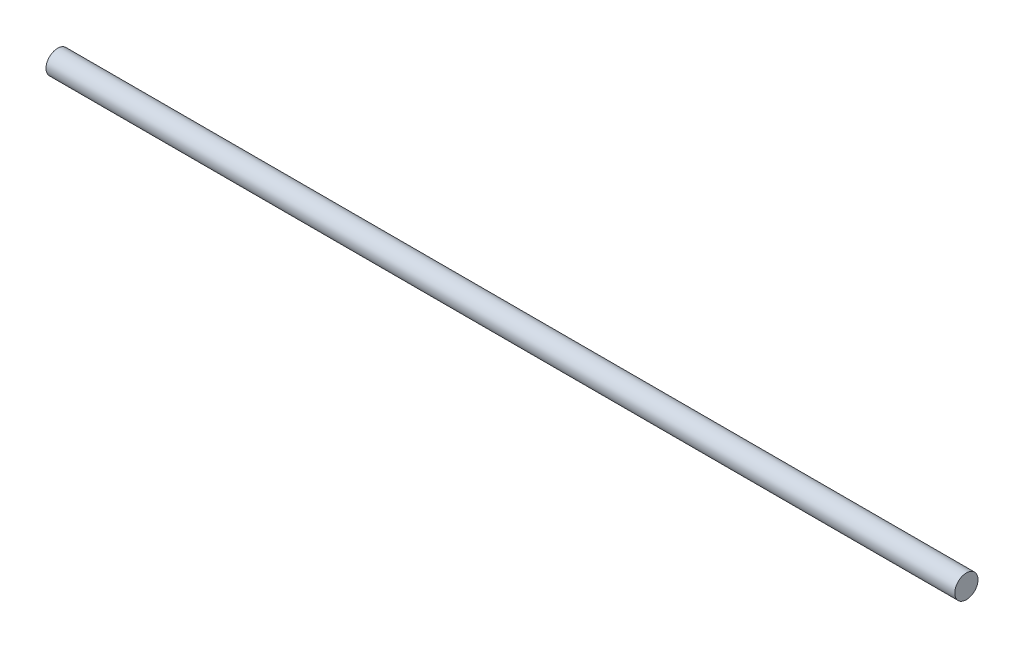
ISO-10303-21;
HEADER;
FILE_DESCRIPTION(('STEP AP214'),'2;1');
FILE_NAME('part.step','',(''),(''),'','','');
FILE_SCHEMA(('AUTOMOTIVE_DESIGN { 1 0 10303 214 1 1 1 1 }'));
ENDSEC;
DATA;
#1=APPLICATION_CONTEXT('core data for automotive mechanical design processes');
#2=APPLICATION_PROTOCOL_DEFINITION('international standard','automotive_design',2000,#1);
#3=PRODUCT_CONTEXT('',#1,'mechanical');
#4=PRODUCT('Part','Part','',(#3));
#5=PRODUCT_RELATED_PRODUCT_CATEGORY('part','',(#4));
#6=PRODUCT_DEFINITION_FORMATION('','',#4);
#7=PRODUCT_DEFINITION_CONTEXT('part definition',#1,'design');
#8=PRODUCT_DEFINITION('design','',#6,#7);
#9=PRODUCT_DEFINITION_SHAPE('','',#8);
#10=(LENGTH_UNIT() NAMED_UNIT(*) SI_UNIT(.MILLI.,.METRE.));
#11=(NAMED_UNIT(*) PLANE_ANGLE_UNIT() SI_UNIT($,.RADIAN.));
#12=(NAMED_UNIT(*) SI_UNIT($,.STERADIAN.) SOLID_ANGLE_UNIT());
#13=UNCERTAINTY_MEASURE_WITH_UNIT(LENGTH_MEASURE(1.E-05),#10,'distance_accuracy_value','');
#14=(GEOMETRIC_REPRESENTATION_CONTEXT(3) GLOBAL_UNCERTAINTY_ASSIGNED_CONTEXT((#13)) GLOBAL_UNIT_ASSIGNED_CONTEXT((#10,
#11,#12)) REPRESENTATION_CONTEXT('',''));
#15=CARTESIAN_POINT('',(0.,0.,0.));
#16=DIRECTION('',(0.,0.,1.));
#17=DIRECTION('',(1.,0.,0.));
#18=AXIS2_PLACEMENT_3D('',#15,#16,#17);
#19=CARTESIAN_POINT('',(79.375,0.,0.));
#20=DIRECTION('',(-1.,0.,0.));
#21=DIRECTION('',(0.,0.,1.));
#22=AXIS2_PLACEMENT_3D('',#19,#20,#21);
#23=CYLINDRICAL_SURFACE('',#22,1.016);
#24=CARTESIAN_POINT('',(79.375,0.,0.));
#25=DIRECTION('',(1.,0.,0.));
#26=DIRECTION('',(0.,0.,-1.));
#27=AXIS2_PLACEMENT_3D('',#24,#25,#26);
#28=CIRCLE('',#27,1.016);
#29=CARTESIAN_POINT('',(79.375,0.,1.016));
#30=VERTEX_POINT('',#29);
#31=EDGE_CURVE('E10',#30,#30,#28,.T.);
#32=CARTESIAN_POINT('',(0.,0.,0.));
#33=DIRECTION('',(1.,0.,0.));
#34=DIRECTION('',(0.,0.,-1.));
#35=AXIS2_PLACEMENT_3D('',#32,#33,#34);
#36=CIRCLE('',#35,1.016);
#37=CARTESIAN_POINT('',(0.,0.,1.016));
#38=VERTEX_POINT('',#37);
#39=EDGE_CURVE('E32',#38,#38,#36,.T.);
#40=CARTESIAN_POINT('',(79.375,0.,1.016));
#41=CARTESIAN_POINT('',(78.5481770833333,0.,1.016));
#42=CARTESIAN_POINT('',(77.7213541666667,0.,1.016));
#43=CARTESIAN_POINT('',(76.0677083333333,0.,1.016));
#44=CARTESIAN_POINT('',(75.2408854166667,0.,1.016));
#45=CARTESIAN_POINT('',(73.5872395833333,0.,1.016));
#46=CARTESIAN_POINT('',(72.7604166666667,0.,1.016));
#47=CARTESIAN_POINT('',(71.1067708333333,0.,1.016));
#48=CARTESIAN_POINT('',(70.2799479166667,0.,1.016));
#49=CARTESIAN_POINT('',(68.6263020833333,0.,1.016));
#50=CARTESIAN_POINT('',(67.7994791666666,0.,1.016));
#51=CARTESIAN_POINT('',(66.1458333333333,0.,1.016));
#52=CARTESIAN_POINT('',(65.3190104166667,0.,1.016));
#53=CARTESIAN_POINT('',(63.6653645833333,0.,1.016));
#54=CARTESIAN_POINT('',(62.8385416666667,0.,1.016));
#55=CARTESIAN_POINT('',(61.1848958333333,0.,1.016));
#56=CARTESIAN_POINT('',(60.3580729166667,0.,1.016));
#57=CARTESIAN_POINT('',(58.7044270833333,0.,1.016));
#58=CARTESIAN_POINT('',(57.8776041666667,0.,1.016));
#59=CARTESIAN_POINT('',(56.2239583333333,0.,1.016));
#60=CARTESIAN_POINT('',(55.3971354166667,0.,1.016));
#61=CARTESIAN_POINT('',(53.7434895833333,0.,1.016));
#62=CARTESIAN_POINT('',(52.9166666666667,0.,1.016));
#63=CARTESIAN_POINT('',(51.2630208333333,0.,1.016));
#64=CARTESIAN_POINT('',(50.4361979166667,0.,1.016));
#65=CARTESIAN_POINT('',(48.7825520833333,0.,1.016));
#66=CARTESIAN_POINT('',(47.9557291666667,0.,1.016));
#67=CARTESIAN_POINT('',(46.3020833333333,0.,1.016));
#68=CARTESIAN_POINT('',(45.4752604166667,0.,1.016));
#69=CARTESIAN_POINT('',(43.8216145833333,0.,1.016));
#70=CARTESIAN_POINT('',(42.9947916666667,0.,1.016));
#71=CARTESIAN_POINT('',(41.3411458333333,0.,1.016));
#72=CARTESIAN_POINT('',(40.5143229166667,0.,1.016));
#73=CARTESIAN_POINT('',(38.8606770833333,0.,1.016));
#74=CARTESIAN_POINT('',(38.0338541666667,0.,1.016));
#75=CARTESIAN_POINT('',(36.3802083333333,0.,1.016));
#76=CARTESIAN_POINT('',(35.5533854166667,0.,1.016));
#77=CARTESIAN_POINT('',(33.8997395833333,0.,1.016));
#78=CARTESIAN_POINT('',(33.0729166666667,0.,1.016));
#79=CARTESIAN_POINT('',(31.4192708333333,0.,1.016));
#80=CARTESIAN_POINT('',(30.5924479166667,0.,1.016));
#81=CARTESIAN_POINT('',(28.9388020833333,0.,1.016));
#82=CARTESIAN_POINT('',(28.1119791666667,0.,1.016));
#83=CARTESIAN_POINT('',(26.4583333333333,0.,1.016));
#84=CARTESIAN_POINT('',(25.6315104166666,0.,1.016));
#85=CARTESIAN_POINT('',(23.9778645833333,0.,1.016));
#86=CARTESIAN_POINT('',(23.1510416666666,0.,1.016));
#87=CARTESIAN_POINT('',(21.4973958333333,0.,1.016));
#88=CARTESIAN_POINT('',(20.6705729166666,0.,1.016));
#89=CARTESIAN_POINT('',(19.0169270833333,0.,1.016));
#90=CARTESIAN_POINT('',(18.1901041666666,0.,1.016));
#91=CARTESIAN_POINT('',(16.5364583333333,0.,1.016));
#92=CARTESIAN_POINT('',(15.7096354166667,0.,1.016));
#93=CARTESIAN_POINT('',(14.0559895833333,0.,1.016));
#94=CARTESIAN_POINT('',(13.2291666666667,0.,1.016));
#95=CARTESIAN_POINT('',(11.5755208333333,0.,1.016));
#96=CARTESIAN_POINT('',(10.7486979166667,0.,1.016));
#97=CARTESIAN_POINT('',(9.09505208333332,0.,1.016));
#98=CARTESIAN_POINT('',(8.26822916666666,0.,1.016));
#99=CARTESIAN_POINT('',(6.61458333333332,0.,1.016));
#100=CARTESIAN_POINT('',(5.78776041666665,0.,1.016));
#101=CARTESIAN_POINT('',(4.13411458333332,0.,1.016));
#102=CARTESIAN_POINT('',(3.30729166666666,0.,1.016));
#103=CARTESIAN_POINT('',(1.65364583333332,0.,1.016));
#104=CARTESIAN_POINT('',(0.826822916666655,0.,1.016));
#105=CARTESIAN_POINT('',(0.,0.,1.016));
#106=B_SPLINE_CURVE_WITH_KNOTS('',3,(#40,#41,#42,#43,#44,#45,#46,#47,#48,#49,#50,#51,#52,#53,
#54,#55,#56,#57,#58,#59,#60,#61,#62,#63,#64,#65,#66,#67,#68,#69,#70,#71,#72,#73,#74,#75,#76,#77,
#78,#79,#80,#81,#82,#83,#84,#85,#86,#87,#88,#89,#90,#91,#92,#93,#94,#95,#96,#97,#98,#99,#100,
#101,#102,#103,#104,#105),.UNSPECIFIED.,.F.,.F.,(4,2,2,2,2,2,2,2,2,2,2,2,2,2,2,2,2,2,2,2,2,2,2,
2,2,2,2,2,2,2,2,2,4),(0.,2.48046875000001,4.96093750000001,7.44140625,9.92187500000001,
12.40234375,14.8828125,17.36328125,19.84375,22.32421875,24.8046875,27.28515625,29.765625,
32.24609375,34.7265625,37.20703125,39.6875,42.16796875,44.6484375,47.12890625,49.609375,
52.08984375,54.5703125,57.05078125,59.53125,62.01171875,64.4921875,66.97265625,69.453125,
71.93359375,74.4140625,76.89453125,79.375),.UNSPECIFIED.);
#107=EDGE_CURVE('BSEAM29',#30,#38,#106,.T.);
#108=ORIENTED_EDGE('',*,*,#31,.F.);
#109=ORIENTED_EDGE('',*,*,#39,.T.);
#110=ORIENTED_EDGE('',*,*,#107,.T.);
#111=ORIENTED_EDGE('',*,*,#107,.F.);
#112=EDGE_LOOP('',(#108,#110,#109,#111));
#113=FACE_BOUND('',#112,.T.);
#114=ADVANCED_FACE('F29',(#113),#23,.T.);
#115=CARTESIAN_POINT('',(79.375,0.,0.));
#116=DIRECTION('',(1.,0.,0.));
#117=DIRECTION('',(0.,0.,-1.));
#118=AXIS2_PLACEMENT_3D('',#115,#116,#117);
#119=PLANE('',#118);
#120=ORIENTED_EDGE('',*,*,#31,.T.);
#121=EDGE_LOOP('',(#120));
#122=FACE_BOUND('',#121,.T.);
#123=ADVANCED_FACE('F44',(#122),#119,.T.);
#124=CARTESIAN_POINT('',(0.,0.,0.));
#125=DIRECTION('',(1.,0.,0.));
#126=DIRECTION('',(0.,0.,-1.));
#127=AXIS2_PLACEMENT_3D('',#124,#125,#126);
#128=PLANE('',#127);
#129=ORIENTED_EDGE('',*,*,#39,.F.);
#130=EDGE_LOOP('',(#129));
#131=FACE_BOUND('',#130,.T.);
#132=ADVANCED_FACE('F42',(#131),#128,.F.);
#133=CLOSED_SHELL('',(#114,#123,#132));
#134=MANIFOLD_SOLID_BREP('B2',#133);
#135=ADVANCED_BREP_SHAPE_REPRESENTATION('',(#18,#134),#14);
#136=SHAPE_DEFINITION_REPRESENTATION(#9,#135);
ENDSEC;
END-ISO-10303-21;
